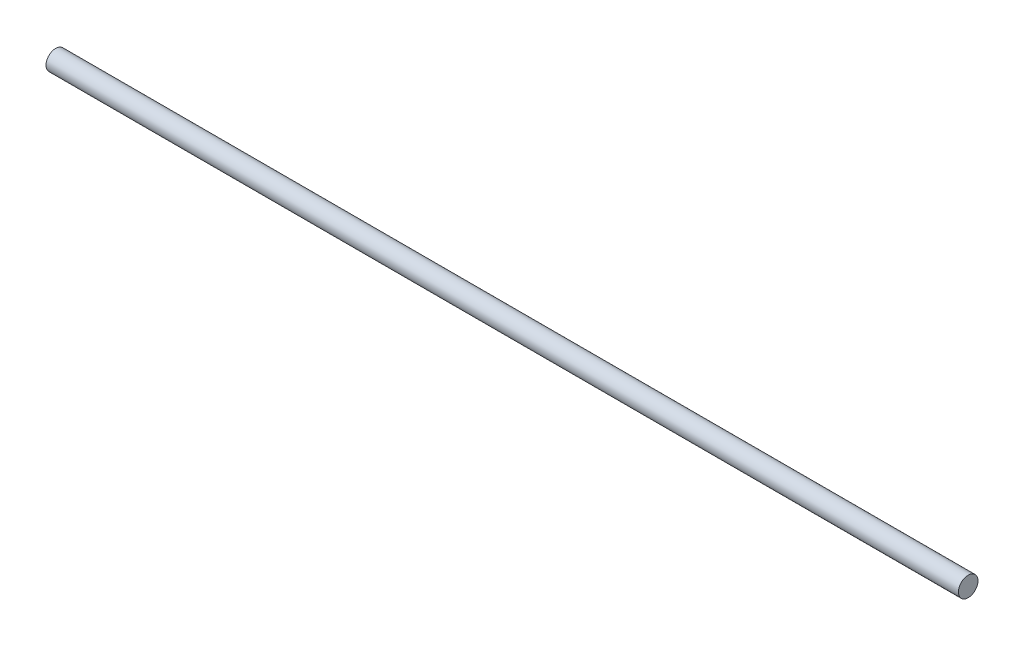
ISO-10303-21;
HEADER;
FILE_DESCRIPTION(('STEP AP214'),'2;1');
FILE_NAME('part.step','',(''),(''),'','','');
FILE_SCHEMA(('AUTOMOTIVE_DESIGN { 1 0 10303 214 1 1 1 1 }'));
ENDSEC;
DATA;
#1=APPLICATION_CONTEXT('core data for automotive mechanical design processes');
#2=APPLICATION_PROTOCOL_DEFINITION('international standard','automotive_design',2000,#1);
#3=PRODUCT_CONTEXT('',#1,'mechanical');
#4=PRODUCT('Part','Part','',(#3));
#5=PRODUCT_RELATED_PRODUCT_CATEGORY('part','',(#4));
#6=PRODUCT_DEFINITION_FORMATION('','',#4);
#7=PRODUCT_DEFINITION_CONTEXT('part definition',#1,'design');
#8=PRODUCT_DEFINITION('design','',#6,#7);
#9=PRODUCT_DEFINITION_SHAPE('','',#8);
#10=(LENGTH_UNIT() NAMED_UNIT(*) SI_UNIT(.MILLI.,.METRE.));
#11=(NAMED_UNIT(*) PLANE_ANGLE_UNIT() SI_UNIT($,.RADIAN.));
#12=(NAMED_UNIT(*) SI_UNIT($,.STERADIAN.) SOLID_ANGLE_UNIT());
#13=UNCERTAINTY_MEASURE_WITH_UNIT(LENGTH_MEASURE(1.E-05),#10,'distance_accuracy_value','');
#14=(GEOMETRIC_REPRESENTATION_CONTEXT(3) GLOBAL_UNCERTAINTY_ASSIGNED_CONTEXT((#13)) GLOBAL_UNIT_ASSIGNED_CONTEXT((#10,
#11,#12)) REPRESENTATION_CONTEXT('',''));
#15=CARTESIAN_POINT('',(0.,0.,0.));
#16=DIRECTION('',(0.,0.,1.));
#17=DIRECTION('',(1.,0.,0.));
#18=AXIS2_PLACEMENT_3D('',#15,#16,#17);
#19=CARTESIAN_POINT('',(-177.8,144.17586970791,-57.6730595824539));
#20=DIRECTION('',(1.,0.,0.));
#21=DIRECTION('',(0.,0.,-1.));
#22=AXIS2_PLACEMENT_3D('',#19,#20,#21);
#23=CYLINDRICAL_SURFACE('',#22,3.81);
#24=CARTESIAN_POINT('',(-177.8,144.17586970791,-57.6730595824539));
#25=DIRECTION('',(1.,0.,0.));
#26=DIRECTION('',(0.,0.,-1.));
#27=AXIS2_PLACEMENT_3D('',#24,#25,#26);
#28=CIRCLE('',#27,3.81);
#29=CARTESIAN_POINT('',(-177.8,144.17586970791,-61.4830595824539));
#30=VERTEX_POINT('',#29);
#31=EDGE_CURVE('E10',#30,#30,#28,.T.);
#32=ORIENTED_EDGE('',*,*,#31,.T.);
#33=EDGE_LOOP('',(#32));
#34=FACE_BOUND('',#33,.T.);
#35=CARTESIAN_POINT('',(177.8,144.17586970791,-57.6730595824539));
#36=DIRECTION('',(1.,0.,0.));
#37=DIRECTION('',(0.,0.,-1.));
#38=AXIS2_PLACEMENT_3D('',#35,#36,#37);
#39=CIRCLE('',#38,3.81);
#40=CARTESIAN_POINT('',(177.8,144.17586970791,-61.4830595824539));
#41=VERTEX_POINT('',#40);
#42=EDGE_CURVE('E37',#41,#41,#39,.T.);
#43=ORIENTED_EDGE('',*,*,#42,.F.);
#44=EDGE_LOOP('',(#43));
#45=FACE_BOUND('',#44,.T.);
#46=ADVANCED_FACE('F31',(#34,#45),#23,.T.);
#47=CARTESIAN_POINT('',(-177.8,144.17586970791,-57.6730595824539));
#48=DIRECTION('',(1.,0.,0.));
#49=DIRECTION('',(0.,0.,-1.));
#50=AXIS2_PLACEMENT_3D('',#47,#48,#49);
#51=PLANE('',#50);
#52=ORIENTED_EDGE('',*,*,#31,.F.);
#53=EDGE_LOOP('',(#52));
#54=FACE_BOUND('',#53,.T.);
#55=ADVANCED_FACE('F46',(#54),#51,.F.);
#56=CARTESIAN_POINT('',(177.8,144.17586970791,-57.6730595824539));
#57=DIRECTION('',(1.,0.,0.));
#58=DIRECTION('',(0.,0.,-1.));
#59=AXIS2_PLACEMENT_3D('',#56,#57,#58);
#60=PLANE('',#59);
#61=ORIENTED_EDGE('',*,*,#42,.T.);
#62=EDGE_LOOP('',(#61));
#63=FACE_BOUND('',#62,.T.);
#64=ADVANCED_FACE('F43',(#63),#60,.T.);
#65=CLOSED_SHELL('',(#46,#55,#64));
#66=MANIFOLD_SOLID_BREP('B2',#65);
#67=ADVANCED_BREP_SHAPE_REPRESENTATION('',(#18,#66),#14);
#68=SHAPE_DEFINITION_REPRESENTATION(#9,#67);
ENDSEC;
END-ISO-10303-21;
